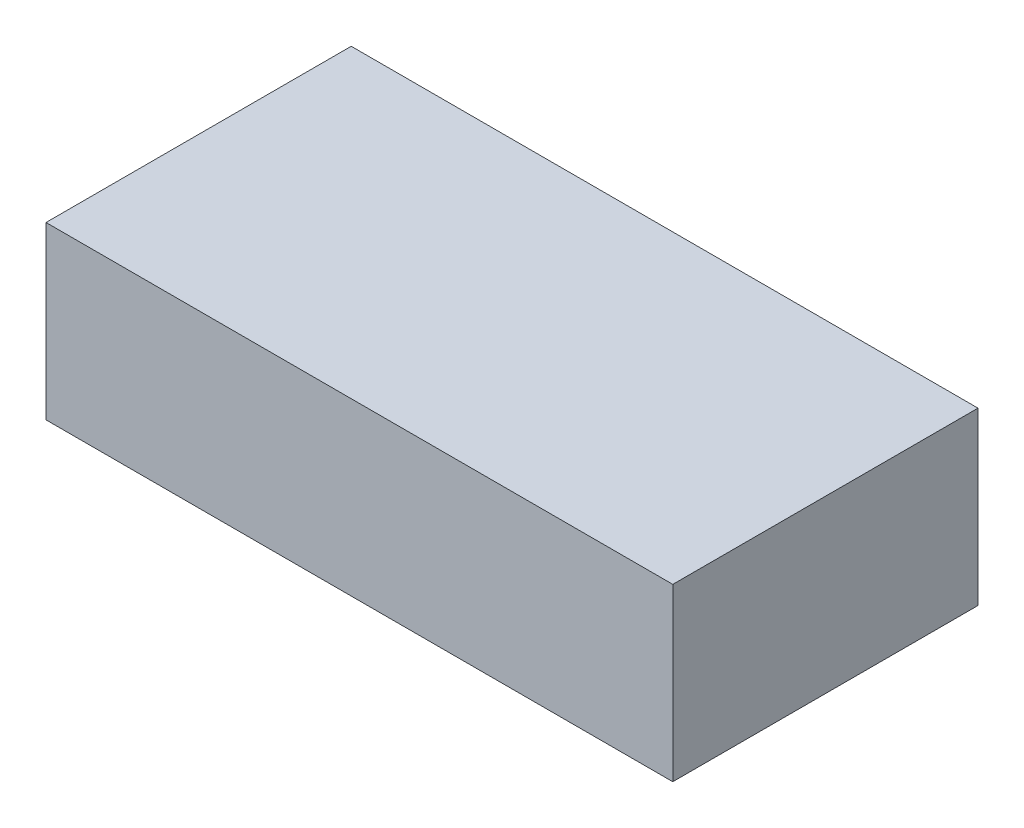
ISO-10303-21;
HEADER;
FILE_DESCRIPTION(('STEP AP214'),'2;1');
FILE_NAME('part.step','',(''),(''),'','','');
FILE_SCHEMA(('AUTOMOTIVE_DESIGN { 1 0 10303 214 1 1 1 1 }'));
ENDSEC;
DATA;
#1=APPLICATION_CONTEXT('core data for automotive mechanical design processes');
#2=APPLICATION_PROTOCOL_DEFINITION('international standard','automotive_design',2000,#1);
#3=PRODUCT_CONTEXT('',#1,'mechanical');
#4=PRODUCT('Part','Part','',(#3));
#5=PRODUCT_RELATED_PRODUCT_CATEGORY('part','',(#4));
#6=PRODUCT_DEFINITION_FORMATION('','',#4);
#7=PRODUCT_DEFINITION_CONTEXT('part definition',#1,'design');
#8=PRODUCT_DEFINITION('design','',#6,#7);
#9=PRODUCT_DEFINITION_SHAPE('','',#8);
#10=(LENGTH_UNIT() NAMED_UNIT(*) SI_UNIT(.MILLI.,.METRE.));
#11=(NAMED_UNIT(*) PLANE_ANGLE_UNIT() SI_UNIT($,.RADIAN.));
#12=(NAMED_UNIT(*) SI_UNIT($,.STERADIAN.) SOLID_ANGLE_UNIT());
#13=UNCERTAINTY_MEASURE_WITH_UNIT(LENGTH_MEASURE(1.E-05),#10,'distance_accuracy_value','');
#14=(GEOMETRIC_REPRESENTATION_CONTEXT(3) GLOBAL_UNCERTAINTY_ASSIGNED_CONTEXT((#13)) GLOBAL_UNIT_ASSIGNED_CONTEXT((#10,
#11,#12)) REPRESENTATION_CONTEXT('',''));
#15=CARTESIAN_POINT('',(0.,0.,0.));
#16=DIRECTION('',(0.,0.,1.));
#17=DIRECTION('',(1.,0.,0.));
#18=AXIS2_PLACEMENT_3D('',#15,#16,#17);
#19=CARTESIAN_POINT('',(0.,0.,32.1390625));
#20=DIRECTION('',(1.,0.,0.));
#21=DIRECTION('',(0.,0.,-1.));
#22=AXIS2_PLACEMENT_3D('',#19,#20,#21);
#23=PLANE('',#22);
#24=DIRECTION('',(0.,0.,-1.));
#25=VECTOR('',#24,1.);
#26=CARTESIAN_POINT('',(0.,0.,32.1390625));
#27=LINE('',#26,#25);
#28=CARTESIAN_POINT('',(0.,0.,16.06953125));
#29=VERTEX_POINT('',#28);
#30=CARTESIAN_POINT('',(0.,0.,0.));
#31=VERTEX_POINT('',#30);
#32=EDGE_CURVE('E11',#29,#31,#27,.T.);
#33=ORIENTED_EDGE('',*,*,#32,.F.);
#34=DIRECTION('',(0.,1.,0.));
#35=VECTOR('',#34,1.);
#36=CARTESIAN_POINT('',(0.,0.,16.06953125));
#37=LINE('',#36,#35);
#38=CARTESIAN_POINT('',(0.,9.,16.06953125));
#39=VERTEX_POINT('',#38);
#40=EDGE_CURVE('E74',#29,#39,#37,.T.);
#41=ORIENTED_EDGE('',*,*,#40,.T.);
#42=DIRECTION('',(0.,0.,-1.));
#43=VECTOR('',#42,1.);
#44=CARTESIAN_POINT('',(0.,9.,32.1390625));
#45=LINE('',#44,#43);
#46=CARTESIAN_POINT('',(0.,9.,0.));
#47=VERTEX_POINT('',#46);
#48=EDGE_CURVE('E55',#39,#47,#45,.T.);
#49=ORIENTED_EDGE('',*,*,#48,.T.);
#50=DIRECTION('',(0.,-1.,0.));
#51=VECTOR('',#50,1.);
#52=CARTESIAN_POINT('',(0.,0.,0.));
#53=LINE('',#52,#51);
#54=EDGE_CURVE('E99',#47,#31,#53,.T.);
#55=ORIENTED_EDGE('',*,*,#54,.T.);
#56=EDGE_LOOP('',(#33,#41,#49,#55));
#57=FACE_BOUND('',#56,.T.);
#58=ADVANCED_FACE('F33',(#57),#23,.F.);
#59=CARTESIAN_POINT('',(0.,0.,32.1390625));
#60=DIRECTION('',(0.,1.,0.));
#61=DIRECTION('',(0.,0.,1.));
#62=AXIS2_PLACEMENT_3D('',#59,#60,#61);
#63=PLANE('',#62);
#64=DIRECTION('',(0.,0.,-1.));
#65=VECTOR('',#64,1.);
#66=CARTESIAN_POINT('',(33.,0.,32.1390625));
#67=LINE('',#66,#65);
#68=CARTESIAN_POINT('',(33.,0.,16.06953125));
#69=VERTEX_POINT('',#68);
#70=CARTESIAN_POINT('',(33.,0.,0.));
#71=VERTEX_POINT('',#70);
#72=EDGE_CURVE('E40',#69,#71,#67,.T.);
#73=ORIENTED_EDGE('',*,*,#72,.F.);
#74=DIRECTION('',(-1.,0.,0.));
#75=VECTOR('',#74,1.);
#76=CARTESIAN_POINT('',(0.,0.,16.06953125));
#77=LINE('',#76,#75);
#78=EDGE_CURVE('E72',#69,#29,#77,.T.);
#79=ORIENTED_EDGE('',*,*,#78,.T.);
#80=ORIENTED_EDGE('',*,*,#32,.T.);
#81=DIRECTION('',(1.,0.,0.));
#82=VECTOR('',#81,1.);
#83=CARTESIAN_POINT('',(0.,0.,0.));
#84=LINE('',#83,#82);
#85=EDGE_CURVE('E89',#31,#71,#84,.T.);
#86=ORIENTED_EDGE('',*,*,#85,.T.);
#87=EDGE_LOOP('',(#73,#79,#80,#86));
#88=FACE_BOUND('',#87,.T.);
#89=ADVANCED_FACE('F87',(#88),#63,.F.);
#90=CARTESIAN_POINT('',(33.,0.,32.1390625));
#91=DIRECTION('',(-1.,0.,0.));
#92=DIRECTION('',(0.,0.,1.));
#93=AXIS2_PLACEMENT_3D('',#90,#91,#92);
#94=PLANE('',#93);
#95=DIRECTION('',(0.,0.,-1.));
#96=VECTOR('',#95,1.);
#97=CARTESIAN_POINT('',(33.,9.,32.1390625));
#98=LINE('',#97,#96);
#99=CARTESIAN_POINT('',(33.,9.,16.06953125));
#100=VERTEX_POINT('',#99);
#101=CARTESIAN_POINT('',(33.,9.,0.));
#102=VERTEX_POINT('',#101);
#103=EDGE_CURVE('E85',#100,#102,#98,.T.);
#104=ORIENTED_EDGE('',*,*,#103,.F.);
#105=DIRECTION('',(0.,1.,0.));
#106=VECTOR('',#105,1.);
#107=CARTESIAN_POINT('',(33.,0.,16.06953125));
#108=LINE('',#107,#106);
#109=EDGE_CURVE('E47',#69,#100,#108,.T.);
#110=ORIENTED_EDGE('',*,*,#109,.F.);
#111=ORIENTED_EDGE('',*,*,#72,.T.);
#112=DIRECTION('',(0.,1.,0.));
#113=VECTOR('',#112,1.);
#114=CARTESIAN_POINT('',(33.,0.,0.));
#115=LINE('',#114,#113);
#116=EDGE_CURVE('E96',#71,#102,#115,.T.);
#117=ORIENTED_EDGE('',*,*,#116,.T.);
#118=EDGE_LOOP('',(#104,#110,#111,#117));
#119=FACE_BOUND('',#118,.T.);
#120=ADVANCED_FACE('F82',(#119),#94,.F.);
#121=CARTESIAN_POINT('',(0.,9.,32.1390625));
#122=DIRECTION('',(0.,-1.,0.));
#123=DIRECTION('',(0.,0.,-1.));
#124=AXIS2_PLACEMENT_3D('',#121,#122,#123);
#125=PLANE('',#124);
#126=ORIENTED_EDGE('',*,*,#48,.F.);
#127=DIRECTION('',(-1.,0.,0.));
#128=VECTOR('',#127,1.);
#129=CARTESIAN_POINT('',(0.,9.,16.06953125));
#130=LINE('',#129,#128);
#131=EDGE_CURVE('E78',#100,#39,#130,.T.);
#132=ORIENTED_EDGE('',*,*,#131,.F.);
#133=ORIENTED_EDGE('',*,*,#103,.T.);
#134=DIRECTION('',(-1.,0.,0.));
#135=VECTOR('',#134,1.);
#136=CARTESIAN_POINT('',(0.,9.,0.));
#137=LINE('',#136,#135);
#138=EDGE_CURVE('E94',#102,#47,#137,.T.);
#139=ORIENTED_EDGE('',*,*,#138,.T.);
#140=EDGE_LOOP('',(#126,#132,#133,#139));
#141=FACE_BOUND('',#140,.T.);
#142=ADVANCED_FACE('F103',(#141),#125,.F.);
#143=CARTESIAN_POINT('',(0.,0.,0.));
#144=DIRECTION('',(0.,0.,-1.));
#145=DIRECTION('',(-1.,0.,0.));
#146=AXIS2_PLACEMENT_3D('',#143,#144,#145);
#147=PLANE('',#146);
#148=ORIENTED_EDGE('',*,*,#54,.F.);
#149=ORIENTED_EDGE('',*,*,#138,.F.);
#150=ORIENTED_EDGE('',*,*,#116,.F.);
#151=ORIENTED_EDGE('',*,*,#85,.F.);
#152=EDGE_LOOP('',(#148,#149,#150,#151));
#153=FACE_BOUND('',#152,.T.);
#154=ADVANCED_FACE('F107',(#153),#147,.T.);
#155=CARTESIAN_POINT('',(0.,0.,16.06953125));
#156=DIRECTION('',(0.,0.,-1.));
#157=DIRECTION('',(-1.,0.,0.));
#158=AXIS2_PLACEMENT_3D('',#155,#156,#157);
#159=PLANE('',#158);
#160=ORIENTED_EDGE('',*,*,#131,.T.);
#161=ORIENTED_EDGE('',*,*,#40,.F.);
#162=ORIENTED_EDGE('',*,*,#78,.F.);
#163=ORIENTED_EDGE('',*,*,#109,.T.);
#164=EDGE_LOOP('',(#160,#161,#162,#163));
#165=FACE_BOUND('',#164,.T.);
#166=ADVANCED_FACE('F73',(#165),#159,.F.);
#167=CLOSED_SHELL('',(#58,#89,#120,#142,#154,#166));
#168=MANIFOLD_SOLID_BREP('B2',#167);
#169=ADVANCED_BREP_SHAPE_REPRESENTATION('',(#18,#168),#14);
#170=SHAPE_DEFINITION_REPRESENTATION(#9,#169);
ENDSEC;
END-ISO-10303-21;
